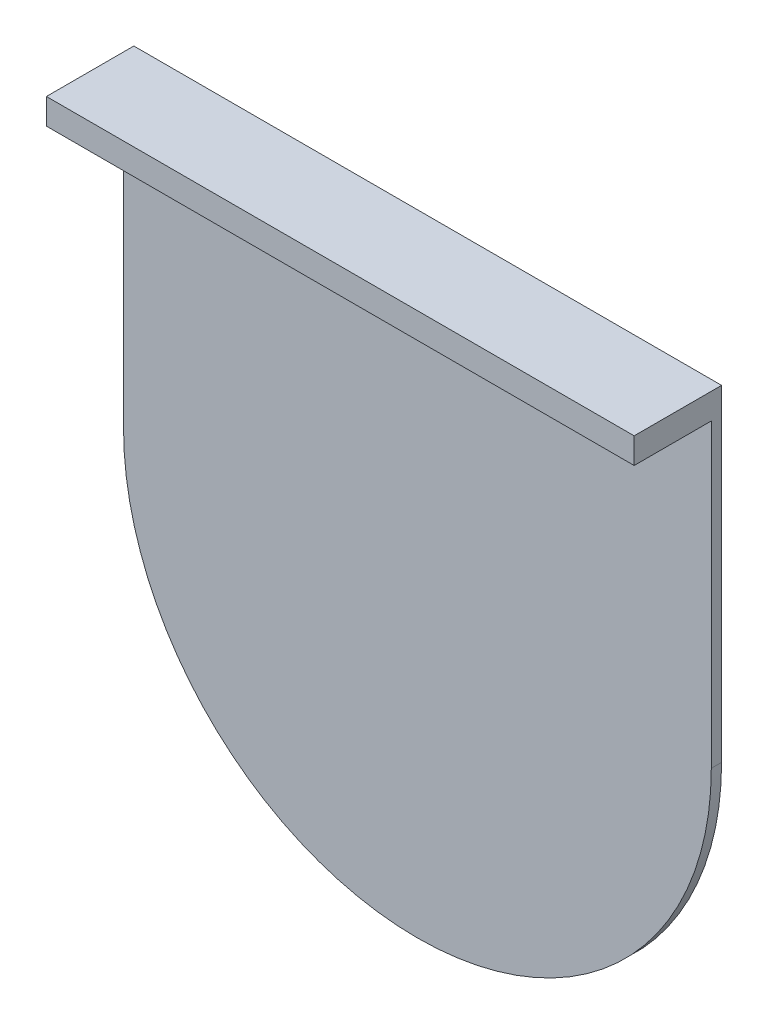
ISO-10303-21;
HEADER;
FILE_DESCRIPTION(('STEP AP214'),'2;1');
FILE_NAME('part.step','',(''),(''),'','','');
FILE_SCHEMA(('AUTOMOTIVE_DESIGN { 1 0 10303 214 1 1 1 1 }'));
ENDSEC;
DATA;
#1=APPLICATION_CONTEXT('core data for automotive mechanical design processes');
#2=APPLICATION_PROTOCOL_DEFINITION('international standard','automotive_design',2000,#1);
#3=PRODUCT_CONTEXT('',#1,'mechanical');
#4=PRODUCT('Part','Part','',(#3));
#5=PRODUCT_RELATED_PRODUCT_CATEGORY('part','',(#4));
#6=PRODUCT_DEFINITION_FORMATION('','',#4);
#7=PRODUCT_DEFINITION_CONTEXT('part definition',#1,'design');
#8=PRODUCT_DEFINITION('design','',#6,#7);
#9=PRODUCT_DEFINITION_SHAPE('','',#8);
#10=(LENGTH_UNIT() NAMED_UNIT(*) SI_UNIT(.MILLI.,.METRE.));
#11=(NAMED_UNIT(*) PLANE_ANGLE_UNIT() SI_UNIT($,.RADIAN.));
#12=(NAMED_UNIT(*) SI_UNIT($,.STERADIAN.) SOLID_ANGLE_UNIT());
#13=UNCERTAINTY_MEASURE_WITH_UNIT(LENGTH_MEASURE(1.E-05),#10,'distance_accuracy_value','');
#14=(GEOMETRIC_REPRESENTATION_CONTEXT(3) GLOBAL_UNCERTAINTY_ASSIGNED_CONTEXT((#13)) GLOBAL_UNIT_ASSIGNED_CONTEXT((#10,
#11,#12)) REPRESENTATION_CONTEXT('',''));
#15=CARTESIAN_POINT('',(0.,0.,0.));
#16=DIRECTION('',(0.,0.,1.));
#17=DIRECTION('',(1.,0.,0.));
#18=AXIS2_PLACEMENT_3D('',#15,#16,#17);
#19=CARTESIAN_POINT('',(0.,57.15,2.));
#20=DIRECTION('',(0.,0.,-1.));
#21=DIRECTION('',(-1.,0.,0.));
#22=AXIS2_PLACEMENT_3D('',#19,#20,#21);
#23=PLANE('',#22);
#24=DIRECTION('',(1.,0.,0.));
#25=VECTOR('',#24,1.);
#26=CARTESIAN_POINT('',(-57.15,115.65,2.));
#27=LINE('',#26,#25);
#28=CARTESIAN_POINT('',(-57.15,115.65,2.));
#29=VERTEX_POINT('',#28);
#30=CARTESIAN_POINT('',(57.15,115.65,2.));
#31=VERTEX_POINT('',#30);
#32=EDGE_CURVE('E50',#29,#31,#27,.T.);
#33=ORIENTED_EDGE('',*,*,#32,.F.);
#34=DIRECTION('',(0.,-1.,0.));
#35=VECTOR('',#34,1.);
#36=CARTESIAN_POINT('',(-57.15,120.65,2.));
#37=LINE('',#36,#35);
#38=CARTESIAN_POINT('',(-57.15,57.15,2.));
#39=VERTEX_POINT('',#38);
#40=EDGE_CURVE('E135',#29,#39,#37,.T.);
#41=ORIENTED_EDGE('',*,*,#40,.T.);
#42=CARTESIAN_POINT('',(0.,57.15,2.));
#43=DIRECTION('',(0.,0.,1.));
#44=DIRECTION('',(-1.,0.,0.));
#45=AXIS2_PLACEMENT_3D('',#42,#43,#44);
#46=CIRCLE('',#45,57.15);
#47=CARTESIAN_POINT('',(57.15,57.15,2.));
#48=VERTEX_POINT('',#47);
#49=EDGE_CURVE('E56',#39,#48,#46,.T.);
#50=ORIENTED_EDGE('',*,*,#49,.T.);
#51=DIRECTION('',(0.,1.,0.));
#52=VECTOR('',#51,1.);
#53=CARTESIAN_POINT('',(57.15,120.65,2.));
#54=LINE('',#53,#52);
#55=EDGE_CURVE('E85',#48,#31,#54,.T.);
#56=ORIENTED_EDGE('',*,*,#55,.T.);
#57=EDGE_LOOP('',(#33,#41,#50,#56));
#58=FACE_BOUND('',#57,.T.);
#59=ADVANCED_FACE('F35',(#58),#23,.F.);
#60=CARTESIAN_POINT('',(57.15,120.65,2.));
#61=DIRECTION('',(-1.,0.,0.));
#62=DIRECTION('',(0.,-1.,0.));
#63=AXIS2_PLACEMENT_3D('',#60,#61,#62);
#64=PLANE('',#63);
#65=DIRECTION('',(0.,1.,0.));
#66=VECTOR('',#65,1.);
#67=CARTESIAN_POINT('',(57.15,120.65,0.));
#68=LINE('',#67,#66);
#69=CARTESIAN_POINT('',(57.15,57.15,0.));
#70=VERTEX_POINT('',#69);
#71=CARTESIAN_POINT('',(57.15,120.65,0.));
#72=VERTEX_POINT('',#71);
#73=EDGE_CURVE('E91',#70,#72,#68,.T.);
#74=ORIENTED_EDGE('',*,*,#73,.T.);
#75=DIRECTION('',(0.,0.,-1.));
#76=VECTOR('',#75,1.);
#77=CARTESIAN_POINT('',(57.15,120.65,2.));
#78=LINE('',#77,#76);
#79=CARTESIAN_POINT('',(57.15,120.65,17.));
#80=VERTEX_POINT('',#79);
#81=EDGE_CURVE('E11',#80,#72,#78,.T.);
#82=ORIENTED_EDGE('',*,*,#81,.F.);
#83=DIRECTION('',(0.,1.,0.));
#84=VECTOR('',#83,1.);
#85=CARTESIAN_POINT('',(57.15,120.65,17.));
#86=LINE('',#85,#84);
#87=CARTESIAN_POINT('',(57.15,115.65,17.));
#88=VERTEX_POINT('',#87);
#89=EDGE_CURVE('E127',#88,#80,#86,.T.);
#90=ORIENTED_EDGE('',*,*,#89,.F.);
#91=DIRECTION('',(0.,0.,-1.));
#92=VECTOR('',#91,1.);
#93=CARTESIAN_POINT('',(57.15,115.65,17.));
#94=LINE('',#93,#92);
#95=EDGE_CURVE('E100',#88,#31,#94,.T.);
#96=ORIENTED_EDGE('',*,*,#95,.T.);
#97=ORIENTED_EDGE('',*,*,#55,.F.);
#98=DIRECTION('',(0.,0.,-1.));
#99=VECTOR('',#98,1.);
#100=CARTESIAN_POINT('',(57.15,57.15,2.));
#101=LINE('',#100,#99);
#102=EDGE_CURVE('E78',#48,#70,#101,.T.);
#103=ORIENTED_EDGE('',*,*,#102,.T.);
#104=EDGE_LOOP('',(#74,#82,#90,#96,#97,#103));
#105=FACE_BOUND('',#104,.T.);
#106=ADVANCED_FACE('F37',(#105),#64,.F.);
#107=CARTESIAN_POINT('',(-57.15,120.65,2.));
#108=DIRECTION('',(0.,-1.,0.));
#109=DIRECTION('',(0.,0.,-1.));
#110=AXIS2_PLACEMENT_3D('',#107,#108,#109);
#111=PLANE('',#110);
#112=DIRECTION('',(-1.,0.,0.));
#113=VECTOR('',#112,1.);
#114=CARTESIAN_POINT('',(-57.15,120.65,0.));
#115=LINE('',#114,#113);
#116=CARTESIAN_POINT('',(-57.15,120.65,0.));
#117=VERTEX_POINT('',#116);
#118=EDGE_CURVE('E95',#72,#117,#115,.T.);
#119=ORIENTED_EDGE('',*,*,#118,.T.);
#120=DIRECTION('',(0.,0.,-1.));
#121=VECTOR('',#120,1.);
#122=CARTESIAN_POINT('',(-57.15,120.65,2.));
#123=LINE('',#122,#121);
#124=CARTESIAN_POINT('',(-57.15,120.65,17.));
#125=VERTEX_POINT('',#124);
#126=EDGE_CURVE('E43',#125,#117,#123,.T.);
#127=ORIENTED_EDGE('',*,*,#126,.F.);
#128=DIRECTION('',(-1.,0.,0.));
#129=VECTOR('',#128,1.);
#130=CARTESIAN_POINT('',(-57.15,120.65,17.));
#131=LINE('',#130,#129);
#132=EDGE_CURVE('E119',#80,#125,#131,.T.);
#133=ORIENTED_EDGE('',*,*,#132,.F.);
#134=ORIENTED_EDGE('',*,*,#81,.T.);
#135=EDGE_LOOP('',(#119,#127,#133,#134));
#136=FACE_BOUND('',#135,.T.);
#137=ADVANCED_FACE('F117',(#136),#111,.F.);
#138=CARTESIAN_POINT('',(-57.15,120.65,2.));
#139=DIRECTION('',(1.,0.,0.));
#140=DIRECTION('',(0.,1.,0.));
#141=AXIS2_PLACEMENT_3D('',#138,#139,#140);
#142=PLANE('',#141);
#143=DIRECTION('',(0.,-1.,0.));
#144=VECTOR('',#143,1.);
#145=CARTESIAN_POINT('',(-57.15,120.65,0.));
#146=LINE('',#145,#144);
#147=CARTESIAN_POINT('',(-57.15,57.15,0.));
#148=VERTEX_POINT('',#147);
#149=EDGE_CURVE('E86',#117,#148,#146,.T.);
#150=ORIENTED_EDGE('',*,*,#149,.T.);
#151=DIRECTION('',(0.,0.,-1.));
#152=VECTOR('',#151,1.);
#153=CARTESIAN_POINT('',(-57.15,57.15,2.));
#154=LINE('',#153,#152);
#155=EDGE_CURVE('E81',#39,#148,#154,.T.);
#156=ORIENTED_EDGE('',*,*,#155,.F.);
#157=ORIENTED_EDGE('',*,*,#40,.F.);
#158=DIRECTION('',(0.,0.,-1.));
#159=VECTOR('',#158,1.);
#160=CARTESIAN_POINT('',(-57.15,115.65,17.));
#161=LINE('',#160,#159);
#162=CARTESIAN_POINT('',(-57.15,115.65,17.));
#163=VERTEX_POINT('',#162);
#164=EDGE_CURVE('E96',#163,#29,#161,.T.);
#165=ORIENTED_EDGE('',*,*,#164,.F.);
#166=DIRECTION('',(0.,-1.,0.));
#167=VECTOR('',#166,1.);
#168=CARTESIAN_POINT('',(-57.15,120.65,17.));
#169=LINE('',#168,#167);
#170=EDGE_CURVE('E113',#125,#163,#169,.T.);
#171=ORIENTED_EDGE('',*,*,#170,.F.);
#172=ORIENTED_EDGE('',*,*,#126,.T.);
#173=EDGE_LOOP('',(#150,#156,#157,#165,#171,#172));
#174=FACE_BOUND('',#173,.T.);
#175=ADVANCED_FACE('F110',(#174),#142,.F.);
#176=CARTESIAN_POINT('',(0.,57.15,2.));
#177=DIRECTION('',(0.,0.,-1.));
#178=DIRECTION('',(-1.,0.,0.));
#179=AXIS2_PLACEMENT_3D('',#176,#177,#178);
#180=CYLINDRICAL_SURFACE('',#179,57.15);
#181=CARTESIAN_POINT('',(0.,57.15,0.));
#182=DIRECTION('',(0.,0.,1.));
#183=DIRECTION('',(-1.,0.,0.));
#184=AXIS2_PLACEMENT_3D('',#181,#182,#183);
#185=CIRCLE('',#184,57.15);
#186=EDGE_CURVE('E75',#148,#70,#185,.T.);
#187=ORIENTED_EDGE('',*,*,#186,.T.);
#188=ORIENTED_EDGE('',*,*,#102,.F.);
#189=ORIENTED_EDGE('',*,*,#49,.F.);
#190=ORIENTED_EDGE('',*,*,#155,.T.);
#191=EDGE_LOOP('',(#187,#188,#189,#190));
#192=FACE_BOUND('',#191,.T.);
#193=ADVANCED_FACE('F77',(#192),#180,.T.);
#194=CARTESIAN_POINT('',(0.,57.15,0.));
#195=DIRECTION('',(0.,0.,-1.));
#196=DIRECTION('',(-1.,0.,0.));
#197=AXIS2_PLACEMENT_3D('',#194,#195,#196);
#198=PLANE('',#197);
#199=ORIENTED_EDGE('',*,*,#73,.F.);
#200=ORIENTED_EDGE('',*,*,#186,.F.);
#201=ORIENTED_EDGE('',*,*,#149,.F.);
#202=ORIENTED_EDGE('',*,*,#118,.F.);
#203=EDGE_LOOP('',(#199,#200,#201,#202));
#204=FACE_BOUND('',#203,.T.);
#205=ADVANCED_FACE('F94',(#204),#198,.T.);
#206=CARTESIAN_POINT('',(-57.15,115.65,17.));
#207=DIRECTION('',(0.,1.,0.));
#208=DIRECTION('',(0.,0.,1.));
#209=AXIS2_PLACEMENT_3D('',#206,#207,#208);
#210=PLANE('',#209);
#211=ORIENTED_EDGE('',*,*,#32,.T.);
#212=ORIENTED_EDGE('',*,*,#95,.F.);
#213=DIRECTION('',(1.,0.,0.));
#214=VECTOR('',#213,1.);
#215=CARTESIAN_POINT('',(-57.15,115.65,17.));
#216=LINE('',#215,#214);
#217=EDGE_CURVE('E130',#163,#88,#216,.T.);
#218=ORIENTED_EDGE('',*,*,#217,.F.);
#219=ORIENTED_EDGE('',*,*,#164,.T.);
#220=EDGE_LOOP('',(#211,#212,#218,#219));
#221=FACE_BOUND('',#220,.T.);
#222=ADVANCED_FACE('F138',(#221),#210,.F.);
#223=CARTESIAN_POINT('',(0.,0.,17.));
#224=DIRECTION('',(0.,0.,1.));
#225=DIRECTION('',(1.,0.,0.));
#226=AXIS2_PLACEMENT_3D('',#223,#224,#225);
#227=PLANE('',#226);
#228=ORIENTED_EDGE('',*,*,#170,.T.);
#229=ORIENTED_EDGE('',*,*,#217,.T.);
#230=ORIENTED_EDGE('',*,*,#89,.T.);
#231=ORIENTED_EDGE('',*,*,#132,.T.);
#232=EDGE_LOOP('',(#228,#229,#230,#231));
#233=FACE_BOUND('',#232,.T.);
#234=ADVANCED_FACE('F123',(#233),#227,.T.);
#235=CLOSED_SHELL('',(#59,#106,#137,#175,#193,#205,#222,#234));
#236=MANIFOLD_SOLID_BREP('B2',#235);
#237=ADVANCED_BREP_SHAPE_REPRESENTATION('',(#18,#236),#14);
#238=SHAPE_DEFINITION_REPRESENTATION(#9,#237);
ENDSEC;
END-ISO-10303-21;
